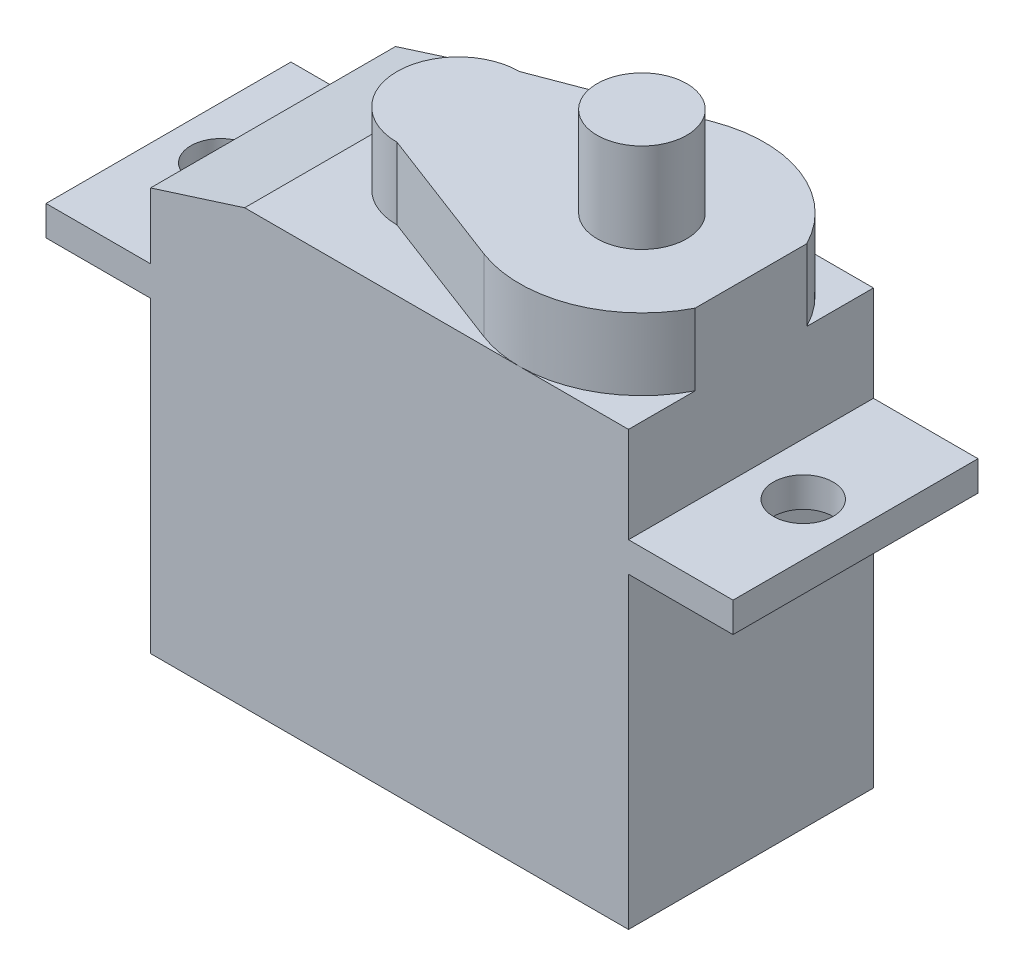
ISO-10303-21;
HEADER;
FILE_DESCRIPTION(('STEP AP214'),'2;1');
FILE_NAME('part.step','',(''),(''),'','','');
FILE_SCHEMA(('AUTOMOTIVE_DESIGN { 1 0 10303 214 1 1 1 1 }'));
ENDSEC;
DATA;
#1=APPLICATION_CONTEXT('core data for automotive mechanical design processes');
#2=APPLICATION_PROTOCOL_DEFINITION('international standard','automotive_design',2000,#1);
#3=PRODUCT_CONTEXT('',#1,'mechanical');
#4=PRODUCT('Part','Part','',(#3));
#5=PRODUCT_RELATED_PRODUCT_CATEGORY('part','',(#4));
#6=PRODUCT_DEFINITION_FORMATION('','',#4);
#7=PRODUCT_DEFINITION_CONTEXT('part definition',#1,'design');
#8=PRODUCT_DEFINITION('design','',#6,#7);
#9=PRODUCT_DEFINITION_SHAPE('','',#8);
#10=(LENGTH_UNIT() NAMED_UNIT(*) SI_UNIT(.MILLI.,.METRE.));
#11=(NAMED_UNIT(*) PLANE_ANGLE_UNIT() SI_UNIT($,.RADIAN.));
#12=(NAMED_UNIT(*) SI_UNIT($,.STERADIAN.) SOLID_ANGLE_UNIT());
#13=UNCERTAINTY_MEASURE_WITH_UNIT(LENGTH_MEASURE(1.E-05),#10,'distance_accuracy_value','');
#14=(GEOMETRIC_REPRESENTATION_CONTEXT(3) GLOBAL_UNCERTAINTY_ASSIGNED_CONTEXT((#13)) GLOBAL_UNIT_ASSIGNED_CONTEXT((#10,
#11,#12)) REPRESENTATION_CONTEXT('',''));
#15=CARTESIAN_POINT('',(0.,0.,0.));
#16=DIRECTION('',(0.,0.,1.));
#17=DIRECTION('',(1.,0.,0.));
#18=AXIS2_PLACEMENT_3D('',#15,#16,#17);
#19=CARTESIAN_POINT('',(0.,14.5,0.));
#20=DIRECTION('',(0.,1.,0.));
#21=DIRECTION('',(0.,0.,1.));
#22=AXIS2_PLACEMENT_3D('',#19,#20,#21);
#23=PLANE('',#22);
#24=DIRECTION('',(-1.,0.,0.));
#25=VECTOR('',#24,1.);
#26=CARTESIAN_POINT('',(-8.,14.5,-4.1));
#27=LINE('',#26,#25);
#28=CARTESIAN_POINT('',(4.35,14.5,-4.1));
#29=VERTEX_POINT('',#28);
#30=CARTESIAN_POINT('',(-4.84999999999999,14.5,-4.1));
#31=VERTEX_POINT('',#30);
#32=EDGE_CURVE('E395',#29,#31,#27,.T.);
#33=ORIENTED_EDGE('',*,*,#32,.T.);
#34=DIRECTION('',(0.,0.,-1.));
#35=VECTOR('',#34,1.);
#36=CARTESIAN_POINT('',(-4.84999999999999,14.5,10.));
#37=LINE('',#36,#35);
#38=CARTESIAN_POINT('',(-4.84999999999999,14.5,4.1));
#39=VERTEX_POINT('',#38);
#40=EDGE_CURVE('E191',#39,#31,#37,.T.);
#41=ORIENTED_EDGE('',*,*,#40,.F.);
#42=DIRECTION('',(1.,0.,0.));
#43=VECTOR('',#42,1.);
#44=CARTESIAN_POINT('',(-8.,14.5,4.1));
#45=LINE('',#44,#43);
#46=CARTESIAN_POINT('',(4.35,14.5,4.1));
#47=VERTEX_POINT('',#46);
#48=EDGE_CURVE('E189',#39,#47,#45,.T.);
#49=ORIENTED_EDGE('',*,*,#48,.T.);
#50=CARTESIAN_POINT('',(4.35,14.5,0.));
#51=DIRECTION('',(0.,1.,0.));
#52=DIRECTION('',(0.,0.,1.));
#53=AXIS2_PLACEMENT_3D('',#50,#51,#52);
#54=CIRCLE('',#53,4.1);
#55=CARTESIAN_POINT('',(2.89429079454111,14.5,3.83287238362331));
#56=VERTEX_POINT('',#55);
#57=EDGE_CURVE('E327',#47,#56,#54,.F.);
#58=ORIENTED_EDGE('',*,*,#57,.T.);
#59=DIRECTION('',(-0.934846922834953,0.,-0.355051025721682));
#60=VECTOR('',#59,1.);
#61=CARTESIAN_POINT('',(-0.907342851191715,14.5,2.38902752264621));
#62=LINE('',#61,#60);
#63=CARTESIAN_POINT('',(-1.8,14.5,2.05));
#64=VERTEX_POINT('',#63);
#65=EDGE_CURVE('E300',#56,#64,#62,.T.);
#66=ORIENTED_EDGE('',*,*,#65,.T.);
#67=CARTESIAN_POINT('',(-1.8,14.5,0.));
#68=DIRECTION('',(0.,1.,0.));
#69=DIRECTION('',(0.,0.,1.));
#70=AXIS2_PLACEMENT_3D('',#67,#68,#69);
#71=CIRCLE('',#70,2.05);
#72=CARTESIAN_POINT('',(-1.8,14.5,-2.05));
#73=VERTEX_POINT('',#72);
#74=EDGE_CURVE('E315',#64,#73,#71,.F.);
#75=ORIENTED_EDGE('',*,*,#74,.T.);
#76=DIRECTION('',(0.934846922834953,0.,-0.355051025721682));
#77=VECTOR('',#76,1.);
#78=CARTESIAN_POINT('',(-0.907342851191715,14.5,-2.38902752264621));
#79=LINE('',#78,#77);
#80=CARTESIAN_POINT('',(2.89429079454111,14.5,-3.83287238362331));
#81=VERTEX_POINT('',#80);
#82=EDGE_CURVE('E319',#73,#81,#79,.T.);
#83=ORIENTED_EDGE('',*,*,#82,.T.);
#84=CARTESIAN_POINT('',(4.35,14.5,0.));
#85=DIRECTION('',(0.,1.,0.));
#86=DIRECTION('',(0.,0.,1.));
#87=AXIS2_PLACEMENT_3D('',#84,#85,#86);
#88=CIRCLE('',#87,4.1);
#89=EDGE_CURVE('E323',#81,#29,#88,.F.);
#90=ORIENTED_EDGE('',*,*,#89,.T.);
#91=EDGE_LOOP('',(#33,#41,#49,#58,#66,#75,#83,#90));
#92=FACE_BOUND('',#91,.T.);
#93=ADVANCED_FACE('F40',(#92),#23,.T.);
#94=CARTESIAN_POINT('',(-8.,10.3,-4.1));
#95=DIRECTION('',(0.,0.,1.));
#96=DIRECTION('',(1.,0.,0.));
#97=AXIS2_PLACEMENT_3D('',#94,#95,#96);
#98=PLANE('',#97);
#99=DIRECTION('',(-0.953124267144543,-0.302579132426838,0.));
#100=VECTOR('',#99,1.);
#101=CARTESIAN_POINT('',(-8.9228656443122,13.2070267795834,-4.1));
#102=LINE('',#101,#100);
#103=CARTESIAN_POINT('',(-8.,13.5,-4.1));
#104=VERTEX_POINT('',#103);
#105=EDGE_CURVE('E55',#31,#104,#102,.T.);
#106=ORIENTED_EDGE('',*,*,#105,.F.);
#107=ORIENTED_EDGE('',*,*,#32,.F.);
#108=CARTESIAN_POINT('',(8.,14.5,-4.1));
#109=VERTEX_POINT('',#108);
#110=EDGE_CURVE('E396',#109,#29,#27,.T.);
#111=ORIENTED_EDGE('',*,*,#110,.F.);
#112=DIRECTION('',(0.,-1.,0.));
#113=VECTOR('',#112,1.);
#114=CARTESIAN_POINT('',(8.,14.5,-4.1));
#115=LINE('',#114,#113);
#116=CARTESIAN_POINT('',(8.,11.3,-4.1));
#117=VERTEX_POINT('',#116);
#118=EDGE_CURVE('E203',#109,#117,#115,.T.);
#119=ORIENTED_EDGE('',*,*,#118,.T.);
#120=DIRECTION('',(-1.,0.,0.));
#121=VECTOR('',#120,1.);
#122=CARTESIAN_POINT('',(-11.5,11.3,-4.1));
#123=LINE('',#122,#121);
#124=CARTESIAN_POINT('',(11.5,11.3,-4.1));
#125=VERTEX_POINT('',#124);
#126=EDGE_CURVE('E219',#125,#117,#123,.T.);
#127=ORIENTED_EDGE('',*,*,#126,.F.);
#128=DIRECTION('',(0.,-1.,0.));
#129=VECTOR('',#128,1.);
#130=CARTESIAN_POINT('',(11.5,11.3,-4.1));
#131=LINE('',#130,#129);
#132=CARTESIAN_POINT('',(11.5,10.3,-4.1));
#133=VERTEX_POINT('',#132);
#134=EDGE_CURVE('E256',#125,#133,#131,.T.);
#135=ORIENTED_EDGE('',*,*,#134,.T.);
#136=DIRECTION('',(-1.,0.,0.));
#137=VECTOR('',#136,1.);
#138=CARTESIAN_POINT('',(-11.5,10.3,-4.1));
#139=LINE('',#138,#137);
#140=CARTESIAN_POINT('',(8.,10.3,-4.1));
#141=VERTEX_POINT('',#140);
#142=EDGE_CURVE('E234',#133,#141,#139,.T.);
#143=ORIENTED_EDGE('',*,*,#142,.T.);
#144=DIRECTION('',(0.,-1.,0.));
#145=VECTOR('',#144,1.);
#146=CARTESIAN_POINT('',(8.,10.3,-4.1));
#147=LINE('',#146,#145);
#148=CARTESIAN_POINT('',(8.,0.,-4.1));
#149=VERTEX_POINT('',#148);
#150=EDGE_CURVE('E291',#141,#149,#147,.T.);
#151=ORIENTED_EDGE('',*,*,#150,.T.);
#152=DIRECTION('',(-1.,0.,0.));
#153=VECTOR('',#152,1.);
#154=CARTESIAN_POINT('',(-8.,0.,-4.1));
#155=LINE('',#154,#153);
#156=CARTESIAN_POINT('',(-8.,0.,-4.1));
#157=VERTEX_POINT('',#156);
#158=EDGE_CURVE('E272',#149,#157,#155,.T.);
#159=ORIENTED_EDGE('',*,*,#158,.T.);
#160=DIRECTION('',(0.,-1.,0.));
#161=VECTOR('',#160,1.);
#162=CARTESIAN_POINT('',(-8.,10.3,-4.1));
#163=LINE('',#162,#161);
#164=CARTESIAN_POINT('',(-8.,10.3,-4.1));
#165=VERTEX_POINT('',#164);
#166=EDGE_CURVE('E287',#165,#157,#163,.T.);
#167=ORIENTED_EDGE('',*,*,#166,.F.);
#168=CARTESIAN_POINT('',(-11.5,10.3,-4.1));
#169=VERTEX_POINT('',#168);
#170=EDGE_CURVE('E233',#165,#169,#139,.T.);
#171=ORIENTED_EDGE('',*,*,#170,.T.);
#172=DIRECTION('',(0.,-1.,0.));
#173=VECTOR('',#172,1.);
#174=CARTESIAN_POINT('',(-11.5,11.3,-4.1));
#175=LINE('',#174,#173);
#176=CARTESIAN_POINT('',(-11.5,11.3,-4.1));
#177=VERTEX_POINT('',#176);
#178=EDGE_CURVE('E252',#177,#169,#175,.T.);
#179=ORIENTED_EDGE('',*,*,#178,.F.);
#180=CARTESIAN_POINT('',(-8.,11.3,-4.1));
#181=VERTEX_POINT('',#180);
#182=EDGE_CURVE('E217',#181,#177,#123,.T.);
#183=ORIENTED_EDGE('',*,*,#182,.F.);
#184=DIRECTION('',(0.,-1.,0.));
#185=VECTOR('',#184,1.);
#186=CARTESIAN_POINT('',(-8.,14.5,-4.1));
#187=LINE('',#186,#185);
#188=EDGE_CURVE('E198',#104,#181,#187,.T.);
#189=ORIENTED_EDGE('',*,*,#188,.F.);
#190=EDGE_LOOP('',(#106,#107,#111,#119,#127,#135,#143,#151,#159,#167,#171,#179,#183,#189));
#191=FACE_BOUND('',#190,.T.);
#192=ADVANCED_FACE('F434',(#191),#98,.F.);
#193=CARTESIAN_POINT('',(-8.,10.3,4.1));
#194=DIRECTION('',(0.,0.,-1.));
#195=DIRECTION('',(-1.,0.,0.));
#196=AXIS2_PLACEMENT_3D('',#193,#194,#195);
#197=PLANE('',#196);
#198=DIRECTION('',(0.953124267144543,0.302579132426838,0.));
#199=VECTOR('',#198,1.);
#200=CARTESIAN_POINT('',(-8.9228656443122,13.2070267795834,4.1));
#201=LINE('',#200,#199);
#202=CARTESIAN_POINT('',(-8.,13.5,4.1));
#203=VERTEX_POINT('',#202);
#204=EDGE_CURVE('E177',#203,#39,#201,.T.);
#205=ORIENTED_EDGE('',*,*,#204,.F.);
#206=DIRECTION('',(0.,-1.,0.));
#207=VECTOR('',#206,1.);
#208=CARTESIAN_POINT('',(-8.,14.5,4.1));
#209=LINE('',#208,#207);
#210=CARTESIAN_POINT('',(-8.,11.3,4.1));
#211=VERTEX_POINT('',#210);
#212=EDGE_CURVE('E186',#203,#211,#209,.T.);
#213=ORIENTED_EDGE('',*,*,#212,.T.);
#214=DIRECTION('',(1.,0.,0.));
#215=VECTOR('',#214,1.);
#216=CARTESIAN_POINT('',(-11.5,11.3,4.1));
#217=LINE('',#216,#215);
#218=CARTESIAN_POINT('',(-11.5,11.3,4.1));
#219=VERTEX_POINT('',#218);
#220=EDGE_CURVE('E226',#219,#211,#217,.T.);
#221=ORIENTED_EDGE('',*,*,#220,.F.);
#222=DIRECTION('',(0.,-1.,0.));
#223=VECTOR('',#222,1.);
#224=CARTESIAN_POINT('',(-11.5,11.3,4.1));
#225=LINE('',#224,#223);
#226=CARTESIAN_POINT('',(-11.5,10.3,4.1));
#227=VERTEX_POINT('',#226);
#228=EDGE_CURVE('E248',#219,#227,#225,.T.);
#229=ORIENTED_EDGE('',*,*,#228,.T.);
#230=DIRECTION('',(1.,0.,0.));
#231=VECTOR('',#230,1.);
#232=CARTESIAN_POINT('',(-11.5,10.3,4.1));
#233=LINE('',#232,#231);
#234=CARTESIAN_POINT('',(-8.,10.3,4.1));
#235=VERTEX_POINT('',#234);
#236=EDGE_CURVE('E218',#227,#235,#233,.T.);
#237=ORIENTED_EDGE('',*,*,#236,.T.);
#238=DIRECTION('',(0.,-1.,0.));
#239=VECTOR('',#238,1.);
#240=CARTESIAN_POINT('',(-8.,10.3,4.1));
#241=LINE('',#240,#239);
#242=CARTESIAN_POINT('',(-8.,0.,4.1));
#243=VERTEX_POINT('',#242);
#244=EDGE_CURVE('E283',#235,#243,#241,.T.);
#245=ORIENTED_EDGE('',*,*,#244,.T.);
#246=DIRECTION('',(1.,0.,0.));
#247=VECTOR('',#246,1.);
#248=CARTESIAN_POINT('',(-8.,0.,4.1));
#249=LINE('',#248,#247);
#250=CARTESIAN_POINT('',(8.,0.,4.1));
#251=VERTEX_POINT('',#250);
#252=EDGE_CURVE('E265',#243,#251,#249,.T.);
#253=ORIENTED_EDGE('',*,*,#252,.T.);
#254=DIRECTION('',(0.,-1.,0.));
#255=VECTOR('',#254,1.);
#256=CARTESIAN_POINT('',(8.,10.3,4.1));
#257=LINE('',#256,#255);
#258=CARTESIAN_POINT('',(8.,10.3,4.1));
#259=VERTEX_POINT('',#258);
#260=EDGE_CURVE('E269',#259,#251,#257,.T.);
#261=ORIENTED_EDGE('',*,*,#260,.F.);
#262=CARTESIAN_POINT('',(11.5,10.3,4.1));
#263=VERTEX_POINT('',#262);
#264=EDGE_CURVE('E241',#259,#263,#233,.T.);
#265=ORIENTED_EDGE('',*,*,#264,.T.);
#266=DIRECTION('',(0.,-1.,0.));
#267=VECTOR('',#266,1.);
#268=CARTESIAN_POINT('',(11.5,11.3,4.1));
#269=LINE('',#268,#267);
#270=CARTESIAN_POINT('',(11.5,11.3,4.1));
#271=VERTEX_POINT('',#270);
#272=EDGE_CURVE('E229',#271,#263,#269,.T.);
#273=ORIENTED_EDGE('',*,*,#272,.F.);
#274=CARTESIAN_POINT('',(8.,11.3,4.1));
#275=VERTEX_POINT('',#274);
#276=EDGE_CURVE('E225',#275,#271,#217,.T.);
#277=ORIENTED_EDGE('',*,*,#276,.F.);
#278=DIRECTION('',(0.,-1.,0.));
#279=VECTOR('',#278,1.);
#280=CARTESIAN_POINT('',(8.,14.5,4.1));
#281=LINE('',#280,#279);
#282=CARTESIAN_POINT('',(8.,14.5,4.1));
#283=VERTEX_POINT('',#282);
#284=EDGE_CURVE('E199',#283,#275,#281,.T.);
#285=ORIENTED_EDGE('',*,*,#284,.F.);
#286=EDGE_CURVE('E399',#47,#283,#45,.T.);
#287=ORIENTED_EDGE('',*,*,#286,.F.);
#288=ORIENTED_EDGE('',*,*,#48,.F.);
#289=EDGE_LOOP('',(#205,#213,#221,#229,#237,#245,#253,#261,#265,#273,#277,#285,#287,#288));
#290=FACE_BOUND('',#289,.T.);
#291=ADVANCED_FACE('F184',(#290),#197,.F.);
#292=CARTESIAN_POINT('',(-8.,14.5,-4.1));
#293=DIRECTION('',(1.,0.,0.));
#294=DIRECTION('',(0.,0.,-1.));
#295=AXIS2_PLACEMENT_3D('',#292,#293,#294);
#296=PLANE('',#295);
#297=DIRECTION('',(0.,0.,1.));
#298=VECTOR('',#297,1.);
#299=CARTESIAN_POINT('',(-8.,13.5,-4.1));
#300=LINE('',#299,#298);
#301=EDGE_CURVE('E11',#104,#203,#300,.T.);
#302=ORIENTED_EDGE('',*,*,#301,.F.);
#303=ORIENTED_EDGE('',*,*,#188,.T.);
#304=DIRECTION('',(0.,0.,-1.));
#305=VECTOR('',#304,1.);
#306=CARTESIAN_POINT('',(-8.,11.3,0.));
#307=LINE('',#306,#305);
#308=EDGE_CURVE('E196',#211,#181,#307,.T.);
#309=ORIENTED_EDGE('',*,*,#308,.F.);
#310=ORIENTED_EDGE('',*,*,#212,.F.);
#311=EDGE_LOOP('',(#302,#303,#309,#310));
#312=FACE_BOUND('',#311,.T.);
#313=ADVANCED_FACE('F194',(#312),#296,.F.);
#314=DIRECTION('',(0.,0.,-1.));
#315=VECTOR('',#314,1.);
#316=CARTESIAN_POINT('',(8.,14.5,-4.1));
#317=LINE('',#316,#315);
#318=CARTESIAN_POINT('',(8.,14.5,1.8674849396983));
#319=VERTEX_POINT('',#318);
#320=EDGE_CURVE('E391',#283,#319,#317,.T.);
#321=ORIENTED_EDGE('',*,*,#320,.T.);
#322=EDGE_CURVE('E49',#319,#47,#54,.F.);
#323=ORIENTED_EDGE('',*,*,#322,.T.);
#324=ORIENTED_EDGE('',*,*,#286,.T.);
#325=EDGE_LOOP('',(#321,#323,#324));
#326=FACE_BOUND('',#325,.T.);
#327=ADVANCED_FACE('F407',(#326),#23,.T.);
#328=ORIENTED_EDGE('',*,*,#110,.T.);
#329=CARTESIAN_POINT('',(8.,14.5,-1.8674849396983));
#330=VERTEX_POINT('',#329);
#331=EDGE_CURVE('E328',#29,#330,#88,.F.);
#332=ORIENTED_EDGE('',*,*,#331,.T.);
#333=EDGE_CURVE('E390',#330,#109,#317,.T.);
#334=ORIENTED_EDGE('',*,*,#333,.T.);
#335=EDGE_LOOP('',(#328,#332,#334));
#336=FACE_BOUND('',#335,.T.);
#337=ADVANCED_FACE('F424',(#336),#23,.T.);
#338=CARTESIAN_POINT('',(0.,11.3,0.));
#339=DIRECTION('',(0.,1.,0.));
#340=DIRECTION('',(0.,0.,1.));
#341=AXIS2_PLACEMENT_3D('',#338,#339,#340);
#342=PLANE('',#341);
#343=CARTESIAN_POINT('',(9.75,11.3,0.));
#344=DIRECTION('',(0.,1.,0.));
#345=DIRECTION('',(0.,0.,1.));
#346=AXIS2_PLACEMENT_3D('',#343,#344,#345);
#347=CIRCLE('',#346,1.);
#348=CARTESIAN_POINT('',(9.75,11.3,-1.));
#349=VERTEX_POINT('',#348);
#350=EDGE_CURVE('E311',#349,#349,#347,.F.);
#351=ORIENTED_EDGE('',*,*,#350,.T.);
#352=EDGE_LOOP('',(#351));
#353=FACE_BOUND('',#352,.T.);
#354=ORIENTED_EDGE('',*,*,#126,.T.);
#355=DIRECTION('',(0.,0.,1.));
#356=VECTOR('',#355,1.);
#357=CARTESIAN_POINT('',(8.,11.3,0.));
#358=LINE('',#357,#356);
#359=EDGE_CURVE('E297',#117,#275,#358,.T.);
#360=ORIENTED_EDGE('',*,*,#359,.T.);
#361=ORIENTED_EDGE('',*,*,#276,.T.);
#362=DIRECTION('',(0.,0.,-1.));
#363=VECTOR('',#362,1.);
#364=CARTESIAN_POINT('',(11.5,11.3,-4.1));
#365=LINE('',#364,#363);
#366=EDGE_CURVE('E213',#271,#125,#365,.T.);
#367=ORIENTED_EDGE('',*,*,#366,.T.);
#368=EDGE_LOOP('',(#354,#360,#361,#367));
#369=FACE_BOUND('',#368,.T.);
#370=ADVANCED_FACE('F469',(#353,#369),#342,.T.);
#371=CARTESIAN_POINT('',(-9.75,11.3,0.));
#372=DIRECTION('',(0.,1.,0.));
#373=DIRECTION('',(0.,0.,1.));
#374=AXIS2_PLACEMENT_3D('',#371,#372,#373);
#375=CIRCLE('',#374,1.);
#376=CARTESIAN_POINT('',(-9.75,11.3,-1.));
#377=VERTEX_POINT('',#376);
#378=EDGE_CURVE('E305',#377,#377,#375,.F.);
#379=ORIENTED_EDGE('',*,*,#378,.T.);
#380=EDGE_LOOP('',(#379));
#381=FACE_BOUND('',#380,.T.);
#382=ORIENTED_EDGE('',*,*,#220,.T.);
#383=ORIENTED_EDGE('',*,*,#308,.T.);
#384=ORIENTED_EDGE('',*,*,#182,.T.);
#385=DIRECTION('',(0.,0.,1.));
#386=VECTOR('',#385,1.);
#387=CARTESIAN_POINT('',(-11.5,11.3,-4.1));
#388=LINE('',#387,#386);
#389=EDGE_CURVE('E222',#177,#219,#388,.T.);
#390=ORIENTED_EDGE('',*,*,#389,.T.);
#391=EDGE_LOOP('',(#382,#383,#384,#390));
#392=FACE_BOUND('',#391,.T.);
#393=ADVANCED_FACE('F438',(#381,#392),#342,.T.);
#394=CARTESIAN_POINT('',(8.,10.3,-4.1));
#395=DIRECTION('',(-1.,0.,0.));
#396=DIRECTION('',(0.,0.,1.));
#397=AXIS2_PLACEMENT_3D('',#394,#395,#396);
#398=PLANE('',#397);
#399=ORIENTED_EDGE('',*,*,#150,.F.);
#400=DIRECTION('',(0.,0.,-1.));
#401=VECTOR('',#400,1.);
#402=CARTESIAN_POINT('',(8.,10.3,-4.1));
#403=LINE('',#402,#401);
#404=EDGE_CURVE('E261',#259,#141,#403,.T.);
#405=ORIENTED_EDGE('',*,*,#404,.F.);
#406=ORIENTED_EDGE('',*,*,#260,.T.);
#407=DIRECTION('',(0.,0.,-1.));
#408=VECTOR('',#407,1.);
#409=CARTESIAN_POINT('',(8.,0.,-4.1));
#410=LINE('',#409,#408);
#411=EDGE_CURVE('E260',#251,#149,#410,.T.);
#412=ORIENTED_EDGE('',*,*,#411,.T.);
#413=EDGE_LOOP('',(#399,#405,#406,#412));
#414=FACE_BOUND('',#413,.T.);
#415=ADVANCED_FACE('F42',(#414),#398,.F.);
#416=CARTESIAN_POINT('',(-8.,10.3,-4.1));
#417=DIRECTION('',(1.,0.,0.));
#418=DIRECTION('',(0.,0.,-1.));
#419=AXIS2_PLACEMENT_3D('',#416,#417,#418);
#420=PLANE('',#419);
#421=DIRECTION('',(0.,0.,1.));
#422=VECTOR('',#421,1.);
#423=CARTESIAN_POINT('',(-8.,0.,-4.1));
#424=LINE('',#423,#422);
#425=EDGE_CURVE('E275',#157,#243,#424,.T.);
#426=ORIENTED_EDGE('',*,*,#425,.T.);
#427=ORIENTED_EDGE('',*,*,#244,.F.);
#428=DIRECTION('',(0.,0.,1.));
#429=VECTOR('',#428,1.);
#430=CARTESIAN_POINT('',(-8.,10.3,-4.1));
#431=LINE('',#430,#429);
#432=EDGE_CURVE('E264',#165,#235,#431,.T.);
#433=ORIENTED_EDGE('',*,*,#432,.F.);
#434=ORIENTED_EDGE('',*,*,#166,.T.);
#435=EDGE_LOOP('',(#426,#427,#433,#434));
#436=FACE_BOUND('',#435,.T.);
#437=ADVANCED_FACE('F449',(#436),#420,.F.);
#438=CARTESIAN_POINT('',(0.,0.,0.));
#439=DIRECTION('',(0.,1.,0.));
#440=DIRECTION('',(0.,0.,1.));
#441=AXIS2_PLACEMENT_3D('',#438,#439,#440);
#442=PLANE('',#441);
#443=ORIENTED_EDGE('',*,*,#425,.F.);
#444=ORIENTED_EDGE('',*,*,#158,.F.);
#445=ORIENTED_EDGE('',*,*,#411,.F.);
#446=ORIENTED_EDGE('',*,*,#252,.F.);
#447=EDGE_LOOP('',(#443,#444,#445,#446));
#448=FACE_BOUND('',#447,.T.);
#449=ADVANCED_FACE('F454',(#448),#442,.F.);
#450=CARTESIAN_POINT('',(0.,10.3,0.));
#451=DIRECTION('',(0.,1.,0.));
#452=DIRECTION('',(0.,0.,1.));
#453=AXIS2_PLACEMENT_3D('',#450,#451,#452);
#454=PLANE('',#453);
#455=CARTESIAN_POINT('',(9.75,10.3,0.));
#456=DIRECTION('',(0.,1.,0.));
#457=DIRECTION('',(0.,0.,1.));
#458=AXIS2_PLACEMENT_3D('',#455,#456,#457);
#459=CIRCLE('',#458,1.);
#460=CARTESIAN_POINT('',(9.75,10.3,-1.));
#461=VERTEX_POINT('',#460);
#462=EDGE_CURVE('E307',#461,#461,#459,.F.);
#463=ORIENTED_EDGE('',*,*,#462,.F.);
#464=EDGE_LOOP('',(#463));
#465=FACE_BOUND('',#464,.T.);
#466=ORIENTED_EDGE('',*,*,#264,.F.);
#467=ORIENTED_EDGE('',*,*,#404,.T.);
#468=ORIENTED_EDGE('',*,*,#142,.F.);
#469=DIRECTION('',(0.,0.,-1.));
#470=VECTOR('',#469,1.);
#471=CARTESIAN_POINT('',(11.5,10.3,-4.1));
#472=LINE('',#471,#470);
#473=EDGE_CURVE('E212',#263,#133,#472,.T.);
#474=ORIENTED_EDGE('',*,*,#473,.F.);
#475=EDGE_LOOP('',(#466,#467,#468,#474));
#476=FACE_BOUND('',#475,.T.);
#477=ADVANCED_FACE('F467',(#465,#476),#454,.F.);
#478=CARTESIAN_POINT('',(-9.75,10.3,0.));
#479=DIRECTION('',(0.,1.,0.));
#480=DIRECTION('',(0.,0.,1.));
#481=AXIS2_PLACEMENT_3D('',#478,#479,#480);
#482=CIRCLE('',#481,1.);
#483=CARTESIAN_POINT('',(-9.75,10.3,-1.));
#484=VERTEX_POINT('',#483);
#485=EDGE_CURVE('E301',#484,#484,#482,.F.);
#486=ORIENTED_EDGE('',*,*,#485,.F.);
#487=EDGE_LOOP('',(#486));
#488=FACE_BOUND('',#487,.T.);
#489=ORIENTED_EDGE('',*,*,#170,.F.);
#490=ORIENTED_EDGE('',*,*,#432,.T.);
#491=ORIENTED_EDGE('',*,*,#236,.F.);
#492=DIRECTION('',(0.,0.,1.));
#493=VECTOR('',#492,1.);
#494=CARTESIAN_POINT('',(-11.5,10.3,-4.1));
#495=LINE('',#494,#493);
#496=EDGE_CURVE('E238',#169,#227,#495,.T.);
#497=ORIENTED_EDGE('',*,*,#496,.F.);
#498=EDGE_LOOP('',(#489,#490,#491,#497));
#499=FACE_BOUND('',#498,.T.);
#500=ADVANCED_FACE('F446',(#488,#499),#454,.F.);
#501=CARTESIAN_POINT('',(11.5,11.3,-4.1));
#502=DIRECTION('',(-1.,0.,0.));
#503=DIRECTION('',(0.,0.,1.));
#504=AXIS2_PLACEMENT_3D('',#501,#502,#503);
#505=PLANE('',#504);
#506=ORIENTED_EDGE('',*,*,#473,.T.);
#507=ORIENTED_EDGE('',*,*,#134,.F.);
#508=ORIENTED_EDGE('',*,*,#366,.F.);
#509=ORIENTED_EDGE('',*,*,#272,.T.);
#510=EDGE_LOOP('',(#506,#507,#508,#509));
#511=FACE_BOUND('',#510,.T.);
#512=ADVANCED_FACE('F465',(#511),#505,.F.);
#513=CARTESIAN_POINT('',(-11.5,11.3,-4.1));
#514=DIRECTION('',(1.,0.,0.));
#515=DIRECTION('',(0.,0.,-1.));
#516=AXIS2_PLACEMENT_3D('',#513,#514,#515);
#517=PLANE('',#516);
#518=ORIENTED_EDGE('',*,*,#496,.T.);
#519=ORIENTED_EDGE('',*,*,#228,.F.);
#520=ORIENTED_EDGE('',*,*,#389,.F.);
#521=ORIENTED_EDGE('',*,*,#178,.T.);
#522=EDGE_LOOP('',(#518,#519,#520,#521));
#523=FACE_BOUND('',#522,.T.);
#524=ADVANCED_FACE('F473',(#523),#517,.F.);
#525=CARTESIAN_POINT('',(8.,14.5,-4.1));
#526=DIRECTION('',(-1.,0.,0.));
#527=DIRECTION('',(0.,0.,1.));
#528=AXIS2_PLACEMENT_3D('',#525,#526,#527);
#529=PLANE('',#528);
#530=ORIENTED_EDGE('',*,*,#284,.T.);
#531=ORIENTED_EDGE('',*,*,#359,.F.);
#532=ORIENTED_EDGE('',*,*,#118,.F.);
#533=ORIENTED_EDGE('',*,*,#333,.F.);
#534=DIRECTION('',(0.,-1.,0.));
#535=VECTOR('',#534,1.);
#536=CARTESIAN_POINT('',(8.,16.9,-1.8674849396983));
#537=LINE('',#536,#535);
#538=CARTESIAN_POINT('',(8.,16.9,-1.8674849396983));
#539=VERTEX_POINT('',#538);
#540=EDGE_CURVE('E378',#539,#330,#537,.T.);
#541=ORIENTED_EDGE('',*,*,#540,.F.);
#542=DIRECTION('',(0.,0.,-1.));
#543=VECTOR('',#542,1.);
#544=CARTESIAN_POINT('',(8.,16.9,-1.8674849396983));
#545=LINE('',#544,#543);
#546=CARTESIAN_POINT('',(8.,16.9,1.8674849396983));
#547=VERTEX_POINT('',#546);
#548=EDGE_CURVE('E341',#547,#539,#545,.T.);
#549=ORIENTED_EDGE('',*,*,#548,.F.);
#550=DIRECTION('',(0.,-1.,0.));
#551=VECTOR('',#550,1.);
#552=CARTESIAN_POINT('',(8.,16.9,1.8674849396983));
#553=LINE('',#552,#551);
#554=EDGE_CURVE('E306',#547,#319,#553,.T.);
#555=ORIENTED_EDGE('',*,*,#554,.T.);
#556=ORIENTED_EDGE('',*,*,#320,.F.);
#557=EDGE_LOOP('',(#530,#531,#532,#533,#541,#549,#555,#556));
#558=FACE_BOUND('',#557,.T.);
#559=ADVANCED_FACE('F413',(#558),#529,.F.);
#560=CARTESIAN_POINT('',(-9.75,14.5,0.));
#561=DIRECTION('',(0.,-1.,0.));
#562=DIRECTION('',(0.,0.,-1.));
#563=AXIS2_PLACEMENT_3D('',#560,#561,#562);
#564=CYLINDRICAL_SURFACE('',#563,1.);
#565=CARTESIAN_POINT('',(-9.75,11.3,-1.));
#566=CARTESIAN_POINT('',(-9.75,11.2895833333333,-1.));
#567=CARTESIAN_POINT('',(-9.75,11.2791666666667,-1.));
#568=CARTESIAN_POINT('',(-9.75,11.2583333333333,-1.));
#569=CARTESIAN_POINT('',(-9.75,11.2479166666667,-1.));
#570=CARTESIAN_POINT('',(-9.75,11.2270833333333,-1.));
#571=CARTESIAN_POINT('',(-9.75,11.2166666666667,-1.));
#572=CARTESIAN_POINT('',(-9.75,11.1958333333333,-1.));
#573=CARTESIAN_POINT('',(-9.75,11.1854166666667,-1.));
#574=CARTESIAN_POINT('',(-9.75,11.1645833333333,-1.));
#575=CARTESIAN_POINT('',(-9.75,11.1541666666667,-1.));
#576=CARTESIAN_POINT('',(-9.75,11.1333333333333,-1.));
#577=CARTESIAN_POINT('',(-9.75,11.1229166666667,-1.));
#578=CARTESIAN_POINT('',(-9.75,11.1020833333333,-1.));
#579=CARTESIAN_POINT('',(-9.75,11.0916666666667,-1.));
#580=CARTESIAN_POINT('',(-9.75,11.0708333333333,-1.));
#581=CARTESIAN_POINT('',(-9.75,11.0604166666667,-1.));
#582=CARTESIAN_POINT('',(-9.75,11.0395833333333,-1.));
#583=CARTESIAN_POINT('',(-9.75,11.0291666666667,-1.));
#584=CARTESIAN_POINT('',(-9.75,11.0083333333333,-1.));
#585=CARTESIAN_POINT('',(-9.75,10.9979166666667,-1.));
#586=CARTESIAN_POINT('',(-9.75,10.9770833333333,-1.));
#587=CARTESIAN_POINT('',(-9.75,10.9666666666667,-1.));
#588=CARTESIAN_POINT('',(-9.75,10.9458333333333,-1.));
#589=CARTESIAN_POINT('',(-9.75,10.9354166666667,-1.));
#590=CARTESIAN_POINT('',(-9.75,10.9145833333333,-1.));
#591=CARTESIAN_POINT('',(-9.75,10.9041666666667,-1.));
#592=CARTESIAN_POINT('',(-9.75,10.8833333333333,-1.));
#593=CARTESIAN_POINT('',(-9.75,10.8729166666667,-1.));
#594=CARTESIAN_POINT('',(-9.75,10.8520833333333,-1.));
#595=CARTESIAN_POINT('',(-9.75,10.8416666666667,-1.));
#596=CARTESIAN_POINT('',(-9.75,10.8208333333333,-1.));
#597=CARTESIAN_POINT('',(-9.75,10.8104166666667,-1.));
#598=CARTESIAN_POINT('',(-9.75,10.7895833333333,-1.));
#599=CARTESIAN_POINT('',(-9.75,10.7791666666667,-1.));
#600=CARTESIAN_POINT('',(-9.75,10.7583333333333,-1.));
#601=CARTESIAN_POINT('',(-9.75,10.7479166666667,-1.));
#602=CARTESIAN_POINT('',(-9.75,10.7270833333333,-1.));
#603=CARTESIAN_POINT('',(-9.75,10.7166666666667,-1.));
#604=CARTESIAN_POINT('',(-9.75,10.6958333333333,-1.));
#605=CARTESIAN_POINT('',(-9.75,10.6854166666667,-1.));
#606=CARTESIAN_POINT('',(-9.75,10.6645833333333,-1.));
#607=CARTESIAN_POINT('',(-9.75,10.6541666666667,-1.));
#608=CARTESIAN_POINT('',(-9.75,10.6333333333333,-1.));
#609=CARTESIAN_POINT('',(-9.75,10.6229166666667,-1.));
#610=CARTESIAN_POINT('',(-9.75,10.6020833333333,-1.));
#611=CARTESIAN_POINT('',(-9.75,10.5916666666667,-1.));
#612=CARTESIAN_POINT('',(-9.75,10.5708333333333,-1.));
#613=CARTESIAN_POINT('',(-9.75,10.5604166666667,-1.));
#614=CARTESIAN_POINT('',(-9.75,10.5395833333333,-1.));
#615=CARTESIAN_POINT('',(-9.75,10.5291666666667,-1.));
#616=CARTESIAN_POINT('',(-9.75,10.5083333333333,-1.));
#617=CARTESIAN_POINT('',(-9.75,10.4979166666667,-1.));
#618=CARTESIAN_POINT('',(-9.75,10.4770833333333,-1.));
#619=CARTESIAN_POINT('',(-9.75,10.4666666666667,-1.));
#620=CARTESIAN_POINT('',(-9.75,10.4458333333333,-1.));
#621=CARTESIAN_POINT('',(-9.75,10.4354166666667,-1.));
#622=CARTESIAN_POINT('',(-9.75,10.4145833333333,-1.));
#623=CARTESIAN_POINT('',(-9.75,10.4041666666667,-1.));
#624=CARTESIAN_POINT('',(-9.75,10.3833333333333,-1.));
#625=CARTESIAN_POINT('',(-9.75,10.3729166666667,-1.));
#626=CARTESIAN_POINT('',(-9.75,10.3520833333333,-1.));
#627=CARTESIAN_POINT('',(-9.75,10.3416666666667,-1.));
#628=CARTESIAN_POINT('',(-9.75,10.3208333333333,-1.));
#629=CARTESIAN_POINT('',(-9.75,10.3104166666667,-1.));
#630=CARTESIAN_POINT('',(-9.75,10.3,-1.));
#631=B_SPLINE_CURVE_WITH_KNOTS('',3,(#565,#566,#567,#568,#569,#570,#571,#572,#573,#574,#575,
#576,#577,#578,#579,#580,#581,#582,#583,#584,#585,#586,#587,#588,#589,#590,#591,#592,#593,#594,
#595,#596,#597,#598,#599,#600,#601,#602,#603,#604,#605,#606,#607,#608,#609,#610,#611,#612,#613,
#614,#615,#616,#617,#618,#619,#620,#621,#622,#623,#624,#625,#626,#627,#628,#629,#630),
.UNSPECIFIED.,.F.,.F.,(4,2,2,2,2,2,2,2,2,2,2,2,2,2,2,2,2,2,2,2,2,2,2,2,2,2,2,2,2,2,2,2,4),(0.,
0.03125,0.0625000000000001,0.0937500000000001,0.125,0.15625,0.1875,0.21875,0.25,0.28125,0.3125,
0.34375,0.375,0.40625,0.4375,0.46875,0.5,0.53125,0.5625,0.593750000000001,0.625000000000001,
0.656250000000001,0.687500000000001,0.718749999999999,0.749999999999999,0.781249999999999,
0.812499999999999,0.843749999999999,0.874999999999999,0.906249999999999,0.937499999999999,
0.968749999999999,0.999999999999999),.UNSPECIFIED.);
#632=EDGE_CURVE('BSEAM481',#377,#484,#631,.T.);
#633=ORIENTED_EDGE('',*,*,#378,.F.);
#634=ORIENTED_EDGE('',*,*,#485,.T.);
#635=ORIENTED_EDGE('',*,*,#632,.T.);
#636=ORIENTED_EDGE('',*,*,#632,.F.);
#637=EDGE_LOOP('',(#633,#635,#634,#636));
#638=FACE_BOUND('',#637,.T.);
#639=ADVANCED_FACE('F481',(#638),#564,.F.);
#640=CARTESIAN_POINT('',(9.75,14.5,0.));
#641=DIRECTION('',(0.,-1.,0.));
#642=DIRECTION('',(0.,0.,-1.));
#643=AXIS2_PLACEMENT_3D('',#640,#641,#642);
#644=CYLINDRICAL_SURFACE('',#643,1.);
#645=CARTESIAN_POINT('',(9.75,11.3,-1.));
#646=CARTESIAN_POINT('',(9.75,11.2895833333333,-1.));
#647=CARTESIAN_POINT('',(9.75,11.2791666666667,-1.));
#648=CARTESIAN_POINT('',(9.75,11.2583333333333,-1.));
#649=CARTESIAN_POINT('',(9.75,11.2479166666667,-1.));
#650=CARTESIAN_POINT('',(9.75,11.2270833333333,-1.));
#651=CARTESIAN_POINT('',(9.75,11.2166666666667,-1.));
#652=CARTESIAN_POINT('',(9.75,11.1958333333333,-1.));
#653=CARTESIAN_POINT('',(9.75,11.1854166666667,-1.));
#654=CARTESIAN_POINT('',(9.75,11.1645833333333,-1.));
#655=CARTESIAN_POINT('',(9.75,11.1541666666667,-1.));
#656=CARTESIAN_POINT('',(9.75,11.1333333333333,-1.));
#657=CARTESIAN_POINT('',(9.75,11.1229166666667,-1.));
#658=CARTESIAN_POINT('',(9.75,11.1020833333333,-1.));
#659=CARTESIAN_POINT('',(9.75,11.0916666666667,-1.));
#660=CARTESIAN_POINT('',(9.75,11.0708333333333,-1.));
#661=CARTESIAN_POINT('',(9.75,11.0604166666667,-1.));
#662=CARTESIAN_POINT('',(9.75,11.0395833333333,-1.));
#663=CARTESIAN_POINT('',(9.75,11.0291666666667,-1.));
#664=CARTESIAN_POINT('',(9.75,11.0083333333333,-1.));
#665=CARTESIAN_POINT('',(9.75,10.9979166666667,-1.));
#666=CARTESIAN_POINT('',(9.75,10.9770833333333,-1.));
#667=CARTESIAN_POINT('',(9.75,10.9666666666667,-1.));
#668=CARTESIAN_POINT('',(9.75,10.9458333333333,-1.));
#669=CARTESIAN_POINT('',(9.75,10.9354166666667,-1.));
#670=CARTESIAN_POINT('',(9.75,10.9145833333333,-1.));
#671=CARTESIAN_POINT('',(9.75,10.9041666666667,-1.));
#672=CARTESIAN_POINT('',(9.75,10.8833333333333,-1.));
#673=CARTESIAN_POINT('',(9.75,10.8729166666667,-1.));
#674=CARTESIAN_POINT('',(9.75,10.8520833333333,-1.));
#675=CARTESIAN_POINT('',(9.75,10.8416666666667,-1.));
#676=CARTESIAN_POINT('',(9.75,10.8208333333333,-1.));
#677=CARTESIAN_POINT('',(9.75,10.8104166666667,-1.));
#678=CARTESIAN_POINT('',(9.75,10.7895833333333,-1.));
#679=CARTESIAN_POINT('',(9.75,10.7791666666667,-1.));
#680=CARTESIAN_POINT('',(9.75,10.7583333333333,-1.));
#681=CARTESIAN_POINT('',(9.75,10.7479166666667,-1.));
#682=CARTESIAN_POINT('',(9.75,10.7270833333333,-1.));
#683=CARTESIAN_POINT('',(9.75,10.7166666666667,-1.));
#684=CARTESIAN_POINT('',(9.75,10.6958333333333,-1.));
#685=CARTESIAN_POINT('',(9.75,10.6854166666667,-1.));
#686=CARTESIAN_POINT('',(9.75,10.6645833333333,-1.));
#687=CARTESIAN_POINT('',(9.75,10.6541666666667,-1.));
#688=CARTESIAN_POINT('',(9.75,10.6333333333333,-1.));
#689=CARTESIAN_POINT('',(9.75,10.6229166666667,-1.));
#690=CARTESIAN_POINT('',(9.75,10.6020833333333,-1.));
#691=CARTESIAN_POINT('',(9.75,10.5916666666667,-1.));
#692=CARTESIAN_POINT('',(9.75,10.5708333333333,-1.));
#693=CARTESIAN_POINT('',(9.75,10.5604166666667,-1.));
#694=CARTESIAN_POINT('',(9.75,10.5395833333333,-1.));
#695=CARTESIAN_POINT('',(9.75,10.5291666666667,-1.));
#696=CARTESIAN_POINT('',(9.75,10.5083333333333,-1.));
#697=CARTESIAN_POINT('',(9.75,10.4979166666667,-1.));
#698=CARTESIAN_POINT('',(9.75,10.4770833333333,-1.));
#699=CARTESIAN_POINT('',(9.75,10.4666666666667,-1.));
#700=CARTESIAN_POINT('',(9.75,10.4458333333333,-1.));
#701=CARTESIAN_POINT('',(9.75,10.4354166666667,-1.));
#702=CARTESIAN_POINT('',(9.75,10.4145833333333,-1.));
#703=CARTESIAN_POINT('',(9.75,10.4041666666667,-1.));
#704=CARTESIAN_POINT('',(9.75,10.3833333333333,-1.));
#705=CARTESIAN_POINT('',(9.75,10.3729166666667,-1.));
#706=CARTESIAN_POINT('',(9.75,10.3520833333333,-1.));
#707=CARTESIAN_POINT('',(9.75,10.3416666666667,-1.));
#708=CARTESIAN_POINT('',(9.75,10.3208333333333,-1.));
#709=CARTESIAN_POINT('',(9.75,10.3104166666667,-1.));
#710=CARTESIAN_POINT('',(9.75,10.3,-1.));
#711=B_SPLINE_CURVE_WITH_KNOTS('',3,(#645,#646,#647,#648,#649,#650,#651,#652,#653,#654,#655,
#656,#657,#658,#659,#660,#661,#662,#663,#664,#665,#666,#667,#668,#669,#670,#671,#672,#673,#674,
#675,#676,#677,#678,#679,#680,#681,#682,#683,#684,#685,#686,#687,#688,#689,#690,#691,#692,#693,
#694,#695,#696,#697,#698,#699,#700,#701,#702,#703,#704,#705,#706,#707,#708,#709,#710),
.UNSPECIFIED.,.F.,.F.,(4,2,2,2,2,2,2,2,2,2,2,2,2,2,2,2,2,2,2,2,2,2,2,2,2,2,2,2,2,2,2,2,4),(0.,
0.03125,0.0625000000000001,0.0937500000000001,0.125,0.15625,0.1875,0.21875,0.25,0.28125,0.3125,
0.34375,0.375,0.40625,0.4375,0.46875,0.5,0.53125,0.5625,0.593750000000001,0.625000000000001,
0.656250000000001,0.687500000000001,0.718749999999999,0.749999999999999,0.781249999999999,
0.812499999999999,0.843749999999999,0.874999999999999,0.906249999999999,0.937499999999999,
0.968749999999999,0.999999999999999),.UNSPECIFIED.);
#712=EDGE_CURVE('BSEAM519',#349,#461,#711,.T.);
#713=ORIENTED_EDGE('',*,*,#350,.F.);
#714=ORIENTED_EDGE('',*,*,#462,.T.);
#715=ORIENTED_EDGE('',*,*,#712,.T.);
#716=ORIENTED_EDGE('',*,*,#712,.F.);
#717=EDGE_LOOP('',(#713,#715,#714,#716));
#718=FACE_BOUND('',#717,.T.);
#719=ADVANCED_FACE('F519',(#718),#644,.F.);
#720=CARTESIAN_POINT('',(4.35,16.9,0.));
#721=DIRECTION('',(0.,-1.,0.));
#722=DIRECTION('',(0.,0.,-1.));
#723=AXIS2_PLACEMENT_3D('',#720,#721,#722);
#724=CYLINDRICAL_SURFACE('',#723,4.1);
#725=ORIENTED_EDGE('',*,*,#57,.F.);
#726=ORIENTED_EDGE('',*,*,#322,.F.);
#727=ORIENTED_EDGE('',*,*,#554,.F.);
#728=CARTESIAN_POINT('',(4.35,16.9,0.));
#729=DIRECTION('',(0.,1.,0.));
#730=DIRECTION('',(0.,0.,1.));
#731=AXIS2_PLACEMENT_3D('',#728,#729,#730);
#732=CIRCLE('',#731,4.1);
#733=CARTESIAN_POINT('',(2.89429079454111,16.9,3.83287238362331));
#734=VERTEX_POINT('',#733);
#735=EDGE_CURVE('E334',#734,#547,#732,.T.);
#736=ORIENTED_EDGE('',*,*,#735,.F.);
#737=DIRECTION('',(0.,-1.,0.));
#738=VECTOR('',#737,1.);
#739=CARTESIAN_POINT('',(2.89429079454111,16.9,3.83287238362331));
#740=LINE('',#739,#738);
#741=EDGE_CURVE('E364',#734,#56,#740,.T.);
#742=ORIENTED_EDGE('',*,*,#741,.T.);
#743=EDGE_LOOP('',(#725,#726,#727,#736,#742));
#744=FACE_BOUND('',#743,.T.);
#745=ADVANCED_FACE('F418',(#744),#724,.T.);
#746=CARTESIAN_POINT('',(4.35,16.9,0.));
#747=DIRECTION('',(0.,-1.,0.));
#748=DIRECTION('',(0.,0.,-1.));
#749=AXIS2_PLACEMENT_3D('',#746,#747,#748);
#750=CYLINDRICAL_SURFACE('',#749,4.1);
#751=ORIENTED_EDGE('',*,*,#89,.F.);
#752=DIRECTION('',(0.,-1.,0.));
#753=VECTOR('',#752,1.);
#754=CARTESIAN_POINT('',(2.89429079454111,16.9,-3.83287238362331));
#755=LINE('',#754,#753);
#756=CARTESIAN_POINT('',(2.89429079454111,16.9,-3.83287238362331));
#757=VERTEX_POINT('',#756);
#758=EDGE_CURVE('E374',#757,#81,#755,.T.);
#759=ORIENTED_EDGE('',*,*,#758,.F.);
#760=CARTESIAN_POINT('',(4.35,16.9,0.));
#761=DIRECTION('',(0.,1.,0.));
#762=DIRECTION('',(0.,0.,1.));
#763=AXIS2_PLACEMENT_3D('',#760,#761,#762);
#764=CIRCLE('',#763,4.1);
#765=EDGE_CURVE('E352',#539,#757,#764,.T.);
#766=ORIENTED_EDGE('',*,*,#765,.F.);
#767=ORIENTED_EDGE('',*,*,#540,.T.);
#768=ORIENTED_EDGE('',*,*,#331,.F.);
#769=EDGE_LOOP('',(#751,#759,#766,#767,#768));
#770=FACE_BOUND('',#769,.T.);
#771=ADVANCED_FACE('F526',(#770),#750,.T.);
#772=CARTESIAN_POINT('',(-1.8,16.9,-2.05));
#773=DIRECTION('',(0.355051025721682,0.,0.934846922834953));
#774=DIRECTION('',(0.934846922834953,0.,-0.355051025721682));
#775=AXIS2_PLACEMENT_3D('',#772,#773,#774);
#776=PLANE('',#775);
#777=ORIENTED_EDGE('',*,*,#82,.F.);
#778=DIRECTION('',(0.,-1.,0.));
#779=VECTOR('',#778,1.);
#780=CARTESIAN_POINT('',(-1.8,16.9,-2.05));
#781=LINE('',#780,#779);
#782=CARTESIAN_POINT('',(-1.8,16.9,-2.05));
#783=VERTEX_POINT('',#782);
#784=EDGE_CURVE('E370',#783,#73,#781,.T.);
#785=ORIENTED_EDGE('',*,*,#784,.F.);
#786=DIRECTION('',(-0.934846922834953,0.,0.355051025721682));
#787=VECTOR('',#786,1.);
#788=CARTESIAN_POINT('',(-1.8,16.9,-2.05));
#789=LINE('',#788,#787);
#790=EDGE_CURVE('E355',#757,#783,#789,.T.);
#791=ORIENTED_EDGE('',*,*,#790,.F.);
#792=ORIENTED_EDGE('',*,*,#758,.T.);
#793=EDGE_LOOP('',(#777,#785,#791,#792));
#794=FACE_BOUND('',#793,.T.);
#795=ADVANCED_FACE('F534',(#794),#776,.F.);
#796=CARTESIAN_POINT('',(-1.8,16.9,0.));
#797=DIRECTION('',(0.,-1.,0.));
#798=DIRECTION('',(0.,0.,-1.));
#799=AXIS2_PLACEMENT_3D('',#796,#797,#798);
#800=CYLINDRICAL_SURFACE('',#799,2.05);
#801=ORIENTED_EDGE('',*,*,#74,.F.);
#802=DIRECTION('',(0.,-1.,0.));
#803=VECTOR('',#802,1.);
#804=CARTESIAN_POINT('',(-1.8,16.9,2.05));
#805=LINE('',#804,#803);
#806=CARTESIAN_POINT('',(-1.8,16.9,2.05));
#807=VERTEX_POINT('',#806);
#808=EDGE_CURVE('E63',#807,#64,#805,.T.);
#809=ORIENTED_EDGE('',*,*,#808,.F.);
#810=CARTESIAN_POINT('',(-1.8,16.9,0.));
#811=DIRECTION('',(0.,1.,0.));
#812=DIRECTION('',(0.,0.,1.));
#813=AXIS2_PLACEMENT_3D('',#810,#811,#812);
#814=CIRCLE('',#813,2.05);
#815=EDGE_CURVE('E358',#783,#807,#814,.T.);
#816=ORIENTED_EDGE('',*,*,#815,.F.);
#817=ORIENTED_EDGE('',*,*,#784,.T.);
#818=EDGE_LOOP('',(#801,#809,#816,#817));
#819=FACE_BOUND('',#818,.T.);
#820=ADVANCED_FACE('F537',(#819),#800,.T.);
#821=CARTESIAN_POINT('',(-1.8,16.9,2.05));
#822=DIRECTION('',(0.355051025721682,0.,-0.934846922834953));
#823=DIRECTION('',(-0.934846922834953,0.,-0.355051025721682));
#824=AXIS2_PLACEMENT_3D('',#821,#822,#823);
#825=PLANE('',#824);
#826=ORIENTED_EDGE('',*,*,#65,.F.);
#827=ORIENTED_EDGE('',*,*,#741,.F.);
#828=DIRECTION('',(0.934846922834953,0.,0.355051025721682));
#829=VECTOR('',#828,1.);
#830=CARTESIAN_POINT('',(-1.8,16.9,2.05));
#831=LINE('',#830,#829);
#832=EDGE_CURVE('E361',#807,#734,#831,.T.);
#833=ORIENTED_EDGE('',*,*,#832,.F.);
#834=ORIENTED_EDGE('',*,*,#808,.T.);
#835=EDGE_LOOP('',(#826,#827,#833,#834));
#836=FACE_BOUND('',#835,.T.);
#837=ADVANCED_FACE('F541',(#836),#825,.F.);
#838=CARTESIAN_POINT('',(4.35,16.9,0.));
#839=DIRECTION('',(0.,1.,0.));
#840=DIRECTION('',(0.,0.,1.));
#841=AXIS2_PLACEMENT_3D('',#838,#839,#840);
#842=PLANE('',#841);
#843=CARTESIAN_POINT('',(4.35,16.9,0.));
#844=DIRECTION('',(0.,1.,0.));
#845=DIRECTION('',(0.,0.,1.));
#846=AXIS2_PLACEMENT_3D('',#843,#844,#845);
#847=CIRCLE('',#846,1.5);
#848=CARTESIAN_POINT('',(4.35,16.9,-1.5));
#849=VERTEX_POINT('',#848);
#850=EDGE_CURVE('E331',#849,#849,#847,.F.);
#851=ORIENTED_EDGE('',*,*,#850,.T.);
#852=EDGE_LOOP('',(#851));
#853=FACE_BOUND('',#852,.T.);
#854=ORIENTED_EDGE('',*,*,#735,.T.);
#855=ORIENTED_EDGE('',*,*,#548,.T.);
#856=ORIENTED_EDGE('',*,*,#765,.T.);
#857=ORIENTED_EDGE('',*,*,#790,.T.);
#858=ORIENTED_EDGE('',*,*,#815,.T.);
#859=ORIENTED_EDGE('',*,*,#832,.T.);
#860=EDGE_LOOP('',(#854,#855,#856,#857,#858,#859));
#861=FACE_BOUND('',#860,.T.);
#862=ADVANCED_FACE('F545',(#853,#861),#842,.T.);
#863=CARTESIAN_POINT('',(4.35,19.9,0.));
#864=DIRECTION('',(0.,-1.,0.));
#865=DIRECTION('',(0.,0.,-1.));
#866=AXIS2_PLACEMENT_3D('',#863,#864,#865);
#867=CYLINDRICAL_SURFACE('',#866,1.5);
#868=CARTESIAN_POINT('',(4.35,19.9,0.));
#869=DIRECTION('',(0.,1.,0.));
#870=DIRECTION('',(0.,0.,1.));
#871=AXIS2_PLACEMENT_3D('',#868,#869,#870);
#872=CIRCLE('',#871,1.5);
#873=CARTESIAN_POINT('',(4.35,19.9,-1.5));
#874=VERTEX_POINT('',#873);
#875=EDGE_CURVE('E335',#874,#874,#872,.T.);
#876=CARTESIAN_POINT('',(4.35,16.9,-1.5));
#877=CARTESIAN_POINT('',(4.35,16.93125,-1.5));
#878=CARTESIAN_POINT('',(4.35,16.9625,-1.5));
#879=CARTESIAN_POINT('',(4.35,17.025,-1.5));
#880=CARTESIAN_POINT('',(4.35,17.05625,-1.5));
#881=CARTESIAN_POINT('',(4.35,17.11875,-1.5));
#882=CARTESIAN_POINT('',(4.35,17.15,-1.5));
#883=CARTESIAN_POINT('',(4.35,17.2125,-1.5));
#884=CARTESIAN_POINT('',(4.35,17.24375,-1.5));
#885=CARTESIAN_POINT('',(4.35,17.30625,-1.5));
#886=CARTESIAN_POINT('',(4.35,17.3375,-1.5));
#887=CARTESIAN_POINT('',(4.35,17.4,-1.5));
#888=CARTESIAN_POINT('',(4.35,17.43125,-1.5));
#889=CARTESIAN_POINT('',(4.35,17.49375,-1.5));
#890=CARTESIAN_POINT('',(4.35,17.525,-1.5));
#891=CARTESIAN_POINT('',(4.35,17.5875,-1.5));
#892=CARTESIAN_POINT('',(4.35,17.61875,-1.5));
#893=CARTESIAN_POINT('',(4.35,17.68125,-1.5));
#894=CARTESIAN_POINT('',(4.35,17.7125,-1.5));
#895=CARTESIAN_POINT('',(4.35,17.775,-1.5));
#896=CARTESIAN_POINT('',(4.35,17.80625,-1.5));
#897=CARTESIAN_POINT('',(4.35,17.86875,-1.5));
#898=CARTESIAN_POINT('',(4.35,17.9,-1.5));
#899=CARTESIAN_POINT('',(4.35,17.9625,-1.5));
#900=CARTESIAN_POINT('',(4.35,17.99375,-1.5));
#901=CARTESIAN_POINT('',(4.35,18.05625,-1.5));
#902=CARTESIAN_POINT('',(4.35,18.0875,-1.5));
#903=CARTESIAN_POINT('',(4.35,18.15,-1.5));
#904=CARTESIAN_POINT('',(4.35,18.18125,-1.5));
#905=CARTESIAN_POINT('',(4.35,18.24375,-1.5));
#906=CARTESIAN_POINT('',(4.35,18.275,-1.5));
#907=CARTESIAN_POINT('',(4.35,18.3375,-1.5));
#908=CARTESIAN_POINT('',(4.35,18.36875,-1.5));
#909=CARTESIAN_POINT('',(4.35,18.43125,-1.5));
#910=CARTESIAN_POINT('',(4.35,18.4625,-1.5));
#911=CARTESIAN_POINT('',(4.35,18.525,-1.5));
#912=CARTESIAN_POINT('',(4.35,18.55625,-1.5));
#913=CARTESIAN_POINT('',(4.35,18.61875,-1.5));
#914=CARTESIAN_POINT('',(4.35,18.65,-1.5));
#915=CARTESIAN_POINT('',(4.35,18.7125,-1.5));
#916=CARTESIAN_POINT('',(4.35,18.74375,-1.5));
#917=CARTESIAN_POINT('',(4.35,18.80625,-1.5));
#918=CARTESIAN_POINT('',(4.35,18.8375,-1.5));
#919=CARTESIAN_POINT('',(4.35,18.9,-1.5));
#920=CARTESIAN_POINT('',(4.35,18.93125,-1.5));
#921=CARTESIAN_POINT('',(4.35,18.99375,-1.5));
#922=CARTESIAN_POINT('',(4.35,19.025,-1.5));
#923=CARTESIAN_POINT('',(4.35,19.0875,-1.5));
#924=CARTESIAN_POINT('',(4.35,19.11875,-1.5));
#925=CARTESIAN_POINT('',(4.35,19.18125,-1.5));
#926=CARTESIAN_POINT('',(4.35,19.2125,-1.5));
#927=CARTESIAN_POINT('',(4.35,19.275,-1.5));
#928=CARTESIAN_POINT('',(4.35,19.30625,-1.5));
#929=CARTESIAN_POINT('',(4.35,19.36875,-1.5));
#930=CARTESIAN_POINT('',(4.35,19.4,-1.5));
#931=CARTESIAN_POINT('',(4.35,19.4625,-1.5));
#932=CARTESIAN_POINT('',(4.35,19.49375,-1.5));
#933=CARTESIAN_POINT('',(4.35,19.55625,-1.5));
#934=CARTESIAN_POINT('',(4.35,19.5875,-1.5));
#935=CARTESIAN_POINT('',(4.35,19.65,-1.5));
#936=CARTESIAN_POINT('',(4.35,19.68125,-1.5));
#937=CARTESIAN_POINT('',(4.35,19.74375,-1.5));
#938=CARTESIAN_POINT('',(4.35,19.775,-1.5));
#939=CARTESIAN_POINT('',(4.35,19.8375,-1.5));
#940=CARTESIAN_POINT('',(4.35,19.86875,-1.5));
#941=CARTESIAN_POINT('',(4.35,19.9,-1.5));
#942=B_SPLINE_CURVE_WITH_KNOTS('',3,(#876,#877,#878,#879,#880,#881,#882,#883,#884,#885,#886,
#887,#888,#889,#890,#891,#892,#893,#894,#895,#896,#897,#898,#899,#900,#901,#902,#903,#904,#905,
#906,#907,#908,#909,#910,#911,#912,#913,#914,#915,#916,#917,#918,#919,#920,#921,#922,#923,#924,
#925,#926,#927,#928,#929,#930,#931,#932,#933,#934,#935,#936,#937,#938,#939,#940,#941),
.UNSPECIFIED.,.F.,.F.,(4,2,2,2,2,2,2,2,2,2,2,2,2,2,2,2,2,2,2,2,2,2,2,2,2,2,2,2,2,2,2,2,4),(0.,
0.0937500000000001,0.1875,0.28125,0.375,0.46875,0.5625,0.656250000000001,0.750000000000001,
0.843750000000001,0.937500000000001,1.03125,1.125,1.21875,1.3125,1.40625,1.5,1.59375,1.6875,
1.78125,1.875,1.96875,2.0625,2.15625,2.25,2.34375,2.4375,2.53125,2.625,2.71875,2.8125,2.90625,
3.),.UNSPECIFIED.);
#943=EDGE_CURVE('BSEAM548',#849,#874,#942,.T.);
#944=ORIENTED_EDGE('',*,*,#850,.F.);
#945=ORIENTED_EDGE('',*,*,#875,.F.);
#946=ORIENTED_EDGE('',*,*,#943,.T.);
#947=ORIENTED_EDGE('',*,*,#943,.F.);
#948=EDGE_LOOP('',(#944,#946,#945,#947));
#949=FACE_BOUND('',#948,.T.);
#950=ADVANCED_FACE('F548',(#949),#867,.T.);
#951=CARTESIAN_POINT('',(4.35,19.9,0.));
#952=DIRECTION('',(0.,1.,0.));
#953=DIRECTION('',(0.,0.,1.));
#954=AXIS2_PLACEMENT_3D('',#951,#952,#953);
#955=PLANE('',#954);
#956=ORIENTED_EDGE('',*,*,#875,.T.);
#957=EDGE_LOOP('',(#956));
#958=FACE_BOUND('',#957,.T.);
#959=ADVANCED_FACE('F551',(#958),#955,.T.);
#960=CARTESIAN_POINT('',(-4.84999999999999,14.5,10.));
#961=DIRECTION('',(-0.302579132426838,0.953124267144543,0.));
#962=DIRECTION('',(-0.953124267144543,-0.302579132426838,0.));
#963=AXIS2_PLACEMENT_3D('',#960,#961,#962);
#964=PLANE('',#963);
#965=ORIENTED_EDGE('',*,*,#105,.T.);
#966=ORIENTED_EDGE('',*,*,#301,.T.);
#967=ORIENTED_EDGE('',*,*,#204,.T.);
#968=ORIENTED_EDGE('',*,*,#40,.T.);
#969=EDGE_LOOP('',(#965,#966,#967,#968));
#970=FACE_BOUND('',#969,.T.);
#971=ADVANCED_FACE('F176',(#970),#964,.T.);
#972=CLOSED_SHELL('',(#93,#192,#291,#313,#327,#337,#370,#393,#415,#437,#449,#477,#500,#512,#524,
#559,#639,#719,#745,#771,#795,#820,#837,#862,#950,#959,#971));
#973=MANIFOLD_SOLID_BREP('B2',#972);
#974=ADVANCED_BREP_SHAPE_REPRESENTATION('',(#18,#973),#14);
#975=SHAPE_DEFINITION_REPRESENTATION(#9,#974);
ENDSEC;
END-ISO-10303-21;
